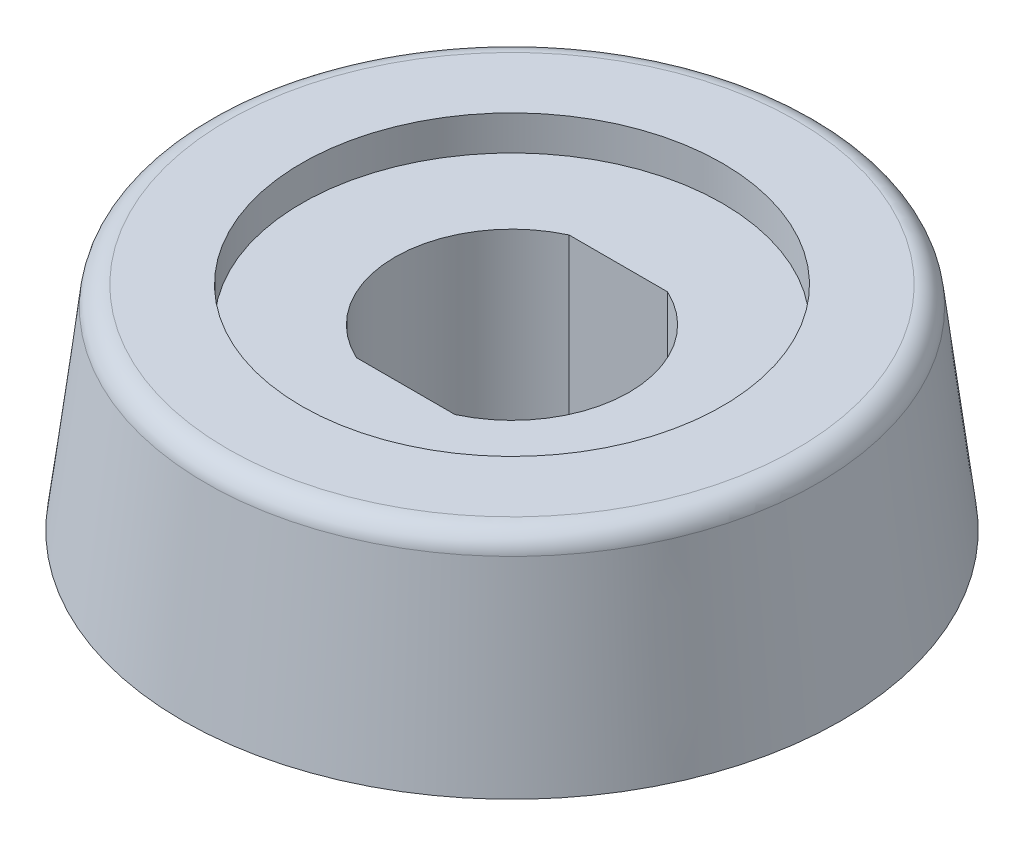
ISO-10303-21;
HEADER;
FILE_DESCRIPTION(('STEP AP214'),'2;1');
FILE_NAME('part.step','',(''),(''),'','','');
FILE_SCHEMA(('AUTOMOTIVE_DESIGN { 1 0 10303 214 1 1 1 1 }'));
ENDSEC;
DATA;
#1=APPLICATION_CONTEXT('core data for automotive mechanical design processes');
#2=APPLICATION_PROTOCOL_DEFINITION('international standard','automotive_design',2000,#1);
#3=PRODUCT_CONTEXT('',#1,'mechanical');
#4=PRODUCT('Part','Part','',(#3));
#5=PRODUCT_RELATED_PRODUCT_CATEGORY('part','',(#4));
#6=PRODUCT_DEFINITION_FORMATION('','',#4);
#7=PRODUCT_DEFINITION_CONTEXT('part definition',#1,'design');
#8=PRODUCT_DEFINITION('design','',#6,#7);
#9=PRODUCT_DEFINITION_SHAPE('','',#8);
#10=(LENGTH_UNIT() NAMED_UNIT(*) SI_UNIT(.MILLI.,.METRE.));
#11=(NAMED_UNIT(*) PLANE_ANGLE_UNIT() SI_UNIT($,.RADIAN.));
#12=(NAMED_UNIT(*) SI_UNIT($,.STERADIAN.) SOLID_ANGLE_UNIT());
#13=UNCERTAINTY_MEASURE_WITH_UNIT(LENGTH_MEASURE(1.E-05),#10,'distance_accuracy_value','');
#14=(GEOMETRIC_REPRESENTATION_CONTEXT(3) GLOBAL_UNCERTAINTY_ASSIGNED_CONTEXT((#13)) GLOBAL_UNIT_ASSIGNED_CONTEXT((#10,
#11,#12)) REPRESENTATION_CONTEXT('',''));
#15=CARTESIAN_POINT('',(0.,0.,0.));
#16=DIRECTION('',(0.,0.,1.));
#17=DIRECTION('',(1.,0.,0.));
#18=AXIS2_PLACEMENT_3D('',#15,#16,#17);
#19=CARTESIAN_POINT('',(-9.325,0.,0.));
#20=DIRECTION('',(0.,-1.,0.));
#21=DIRECTION('',(0.,0.,-1.));
#22=AXIS2_PLACEMENT_3D('',#19,#20,#21);
#23=PLANE('',#22);
#24=CARTESIAN_POINT('',(-9.325,0.,0.));
#25=DIRECTION('',(0.,-1.,0.));
#26=DIRECTION('',(0.,0.,-1.));
#27=AXIS2_PLACEMENT_3D('',#24,#25,#26);
#28=CIRCLE('',#27,5.8);
#29=CARTESIAN_POINT('',(-9.325,0.,-5.8));
#30=VERTEX_POINT('',#29);
#31=EDGE_CURVE('E131',#30,#30,#28,.T.);
#32=ORIENTED_EDGE('',*,*,#31,.F.);
#33=EDGE_LOOP('',(#32));
#34=FACE_BOUND('',#33,.T.);
#35=CARTESIAN_POINT('',(-9.325,0.,0.));
#36=DIRECTION('',(0.,-1.,0.));
#37=DIRECTION('',(0.,0.,-1.));
#38=AXIS2_PLACEMENT_3D('',#35,#36,#37);
#39=CIRCLE('',#38,7.6);
#40=CARTESIAN_POINT('',(-9.325,0.,-7.6));
#41=VERTEX_POINT('',#40);
#42=EDGE_CURVE('E202',#41,#41,#39,.T.);
#43=ORIENTED_EDGE('',*,*,#42,.T.);
#44=EDGE_LOOP('',(#43));
#45=FACE_BOUND('',#44,.T.);
#46=ADVANCED_FACE('F63',(#34,#45),#23,.T.);
#47=CARTESIAN_POINT('',(-9.325,4.9,0.));
#48=DIRECTION('',(0.,-1.,0.));
#49=DIRECTION('',(0.,0.,-1.));
#50=AXIS2_PLACEMENT_3D('',#47,#48,#49);
#51=PLANE('',#50);
#52=CARTESIAN_POINT('',(-9.325,4.9,0.));
#53=DIRECTION('',(0.,-1.,0.));
#54=DIRECTION('',(0.,0.,-1.));
#55=AXIS2_PLACEMENT_3D('',#52,#53,#54);
#56=CIRCLE('',#55,6.55599301929779);
#57=CARTESIAN_POINT('',(-9.325,4.9,-6.55599301929779));
#58=VERTEX_POINT('',#57);
#59=EDGE_CURVE('E13',#58,#58,#56,.F.);
#60=ORIENTED_EDGE('',*,*,#59,.T.);
#61=EDGE_LOOP('',(#60));
#62=FACE_BOUND('',#61,.T.);
#63=CARTESIAN_POINT('',(-9.325,4.9,0.));
#64=DIRECTION('',(0.,-1.,0.));
#65=DIRECTION('',(0.,0.,-1.));
#66=AXIS2_PLACEMENT_3D('',#63,#64,#65);
#67=CIRCLE('',#66,4.85);
#68=CARTESIAN_POINT('',(-9.325,4.9,-4.85));
#69=VERTEX_POINT('',#68);
#70=EDGE_CURVE('E124',#69,#69,#67,.T.);
#71=ORIENTED_EDGE('',*,*,#70,.T.);
#72=EDGE_LOOP('',(#71));
#73=FACE_BOUND('',#72,.T.);
#74=ADVANCED_FACE('F152',(#62,#73),#51,.F.);
#75=CARTESIAN_POINT('',(-9.325,-0.3,0.));
#76=DIRECTION('',(0.,1.,0.));
#77=DIRECTION('',(0.,0.,1.));
#78=AXIS2_PLACEMENT_3D('',#75,#76,#77);
#79=CYLINDRICAL_SURFACE('',#78,5.8);
#80=CARTESIAN_POINT('',(-9.325,-0.3,0.));
#81=DIRECTION('',(0.,-1.,0.));
#82=DIRECTION('',(0.,0.,-1.));
#83=AXIS2_PLACEMENT_3D('',#80,#81,#82);
#84=CIRCLE('',#83,5.8);
#85=CARTESIAN_POINT('',(-9.325,-0.3,-5.8));
#86=VERTEX_POINT('',#85);
#87=EDGE_CURVE('E128',#86,#86,#84,.T.);
#88=ORIENTED_EDGE('',*,*,#87,.F.);
#89=EDGE_LOOP('',(#88));
#90=FACE_BOUND('',#89,.T.);
#91=ORIENTED_EDGE('',*,*,#31,.T.);
#92=EDGE_LOOP('',(#91));
#93=FACE_BOUND('',#92,.T.);
#94=ADVANCED_FACE('F157',(#90,#93),#79,.T.);
#95=CARTESIAN_POINT('',(-9.325,-0.3,0.));
#96=DIRECTION('',(0.,-1.,0.));
#97=DIRECTION('',(0.,0.,-1.));
#98=AXIS2_PLACEMENT_3D('',#95,#96,#97);
#99=PLANE('',#98);
#100=CARTESIAN_POINT('',(-9.325,-0.3,0.));
#101=DIRECTION('',(0.,-1.,0.));
#102=DIRECTION('',(0.,0.,-1.));
#103=AXIS2_PLACEMENT_3D('',#100,#101,#102);
#104=CIRCLE('',#103,3.415);
#105=CARTESIAN_POINT('',(-9.325,-0.3,-3.415));
#106=VERTEX_POINT('',#105);
#107=EDGE_CURVE('E199',#106,#106,#104,.T.);
#108=ORIENTED_EDGE('',*,*,#107,.F.);
#109=EDGE_LOOP('',(#108));
#110=FACE_BOUND('',#109,.T.);
#111=ORIENTED_EDGE('',*,*,#87,.T.);
#112=EDGE_LOOP('',(#111));
#113=FACE_BOUND('',#112,.T.);
#114=ADVANCED_FACE('F165',(#110,#113),#99,.T.);
#115=CARTESIAN_POINT('',(-9.325,-0.3,0.));
#116=DIRECTION('',(0.,1.,0.));
#117=DIRECTION('',(0.,0.,1.));
#118=AXIS2_PLACEMENT_3D('',#115,#116,#117);
#119=CYLINDRICAL_SURFACE('',#118,2.7);
#120=DIRECTION('',(0.,1.,0.));
#121=VECTOR('',#120,1.);
#122=CARTESIAN_POINT('',(-10.459680571791,-0.3,2.45));
#123=LINE('',#122,#121);
#124=CARTESIAN_POINT('',(-10.459680571791,0.,2.45));
#125=VERTEX_POINT('',#124);
#126=CARTESIAN_POINT('',(-10.459680571791,4.1,2.45));
#127=VERTEX_POINT('',#126);
#128=EDGE_CURVE('E120',#125,#127,#123,.T.);
#129=ORIENTED_EDGE('',*,*,#128,.F.);
#130=CARTESIAN_POINT('',(-9.325,0.,0.));
#131=DIRECTION('',(0.,1.,0.));
#132=DIRECTION('',(0.,0.,1.));
#133=AXIS2_PLACEMENT_3D('',#130,#131,#132);
#134=CIRCLE('',#133,2.7);
#135=CARTESIAN_POINT('',(-10.459680571791,0.,-2.45));
#136=VERTEX_POINT('',#135);
#137=EDGE_CURVE('E78',#125,#136,#134,.F.);
#138=ORIENTED_EDGE('',*,*,#137,.T.);
#139=DIRECTION('',(0.,1.,0.));
#140=VECTOR('',#139,1.);
#141=CARTESIAN_POINT('',(-10.459680571791,-0.3,-2.45));
#142=LINE('',#141,#140);
#143=CARTESIAN_POINT('',(-10.459680571791,4.1,-2.45));
#144=VERTEX_POINT('',#143);
#145=EDGE_CURVE('E122',#136,#144,#142,.T.);
#146=ORIENTED_EDGE('',*,*,#145,.T.);
#147=CARTESIAN_POINT('',(-9.325,4.1,0.));
#148=DIRECTION('',(0.,-1.,0.));
#149=DIRECTION('',(0.,0.,-1.));
#150=AXIS2_PLACEMENT_3D('',#147,#148,#149);
#151=CIRCLE('',#150,2.7);
#152=EDGE_CURVE('E136',#144,#127,#151,.F.);
#153=ORIENTED_EDGE('',*,*,#152,.T.);
#154=EDGE_LOOP('',(#129,#138,#146,#153));
#155=FACE_BOUND('',#154,.T.);
#156=ADVANCED_FACE('F169',(#155),#119,.F.);
#157=CARTESIAN_POINT('',(-8.19031942820898,-0.3,-2.45));
#158=DIRECTION('',(0.,0.,-1.));
#159=DIRECTION('',(-1.,0.,0.));
#160=AXIS2_PLACEMENT_3D('',#157,#158,#159);
#161=PLANE('',#160);
#162=ORIENTED_EDGE('',*,*,#145,.F.);
#163=DIRECTION('',(1.,0.,0.));
#164=VECTOR('',#163,1.);
#165=CARTESIAN_POINT('',(-8.19031942820898,0.,-2.45));
#166=LINE('',#165,#164);
#167=CARTESIAN_POINT('',(-8.19031942820898,0.,-2.45));
#168=VERTEX_POINT('',#167);
#169=EDGE_CURVE('E114',#136,#168,#166,.T.);
#170=ORIENTED_EDGE('',*,*,#169,.T.);
#171=DIRECTION('',(0.,1.,0.));
#172=VECTOR('',#171,1.);
#173=CARTESIAN_POINT('',(-8.19031942820898,-0.3,-2.45));
#174=LINE('',#173,#172);
#175=CARTESIAN_POINT('',(-8.19031942820898,4.1,-2.45));
#176=VERTEX_POINT('',#175);
#177=EDGE_CURVE('E113',#168,#176,#174,.T.);
#178=ORIENTED_EDGE('',*,*,#177,.T.);
#179=DIRECTION('',(-1.,0.,0.));
#180=VECTOR('',#179,1.);
#181=CARTESIAN_POINT('',(-8.19031942820898,4.1,-2.45));
#182=LINE('',#181,#180);
#183=EDGE_CURVE('E213',#176,#144,#182,.T.);
#184=ORIENTED_EDGE('',*,*,#183,.T.);
#185=EDGE_LOOP('',(#162,#170,#178,#184));
#186=FACE_BOUND('',#185,.T.);
#187=ADVANCED_FACE('F173',(#186),#161,.F.);
#188=CARTESIAN_POINT('',(-9.325,-0.3,0.));
#189=DIRECTION('',(0.,1.,0.));
#190=DIRECTION('',(0.,0.,1.));
#191=AXIS2_PLACEMENT_3D('',#188,#189,#190);
#192=CYLINDRICAL_SURFACE('',#191,2.7);
#193=ORIENTED_EDGE('',*,*,#177,.F.);
#194=CARTESIAN_POINT('',(-9.325,0.,0.));
#195=DIRECTION('',(0.,1.,0.));
#196=DIRECTION('',(0.,0.,1.));
#197=AXIS2_PLACEMENT_3D('',#194,#195,#196);
#198=CIRCLE('',#197,2.7);
#199=CARTESIAN_POINT('',(-8.19031942820897,0.,2.45));
#200=VERTEX_POINT('',#199);
#201=EDGE_CURVE('E105',#168,#200,#198,.F.);
#202=ORIENTED_EDGE('',*,*,#201,.T.);
#203=DIRECTION('',(0.,1.,0.));
#204=VECTOR('',#203,1.);
#205=CARTESIAN_POINT('',(-8.19031942820897,-0.3,2.45));
#206=LINE('',#205,#204);
#207=CARTESIAN_POINT('',(-8.19031942820897,4.1,2.45));
#208=VERTEX_POINT('',#207);
#209=EDGE_CURVE('E86',#200,#208,#206,.T.);
#210=ORIENTED_EDGE('',*,*,#209,.T.);
#211=CARTESIAN_POINT('',(-9.325,4.1,0.));
#212=DIRECTION('',(0.,-1.,0.));
#213=DIRECTION('',(0.,0.,-1.));
#214=AXIS2_PLACEMENT_3D('',#211,#212,#213);
#215=CIRCLE('',#214,2.7);
#216=EDGE_CURVE('E211',#208,#176,#215,.F.);
#217=ORIENTED_EDGE('',*,*,#216,.T.);
#218=EDGE_LOOP('',(#193,#202,#210,#217));
#219=FACE_BOUND('',#218,.T.);
#220=ADVANCED_FACE('F112',(#219),#192,.F.);
#221=CARTESIAN_POINT('',(-10.459680571791,-0.3,2.45));
#222=DIRECTION('',(0.,0.,1.));
#223=DIRECTION('',(1.,0.,0.));
#224=AXIS2_PLACEMENT_3D('',#221,#222,#223);
#225=PLANE('',#224);
#226=ORIENTED_EDGE('',*,*,#209,.F.);
#227=DIRECTION('',(-1.,0.,0.));
#228=VECTOR('',#227,1.);
#229=CARTESIAN_POINT('',(-10.459680571791,0.,2.45));
#230=LINE('',#229,#228);
#231=EDGE_CURVE('E103',#200,#125,#230,.T.);
#232=ORIENTED_EDGE('',*,*,#231,.T.);
#233=ORIENTED_EDGE('',*,*,#128,.T.);
#234=DIRECTION('',(1.,0.,0.));
#235=VECTOR('',#234,1.);
#236=CARTESIAN_POINT('',(-10.459680571791,4.1,2.45));
#237=LINE('',#236,#235);
#238=EDGE_CURVE('E109',#127,#208,#237,.T.);
#239=ORIENTED_EDGE('',*,*,#238,.T.);
#240=EDGE_LOOP('',(#226,#232,#233,#239));
#241=FACE_BOUND('',#240,.T.);
#242=ADVANCED_FACE('F118',(#241),#225,.F.);
#243=CARTESIAN_POINT('',(-9.325,5.,0.));
#244=DIRECTION('',(0.,-1.,0.));
#245=DIRECTION('',(0.,0.,-1.));
#246=AXIS2_PLACEMENT_3D('',#243,#244,#245);
#247=CYLINDRICAL_SURFACE('',#246,4.85);
#248=CARTESIAN_POINT('',(-9.325,4.1,0.));
#249=DIRECTION('',(0.,-1.,0.));
#250=DIRECTION('',(0.,0.,-1.));
#251=AXIS2_PLACEMENT_3D('',#248,#249,#250);
#252=CIRCLE('',#251,4.85);
#253=CARTESIAN_POINT('',(-9.325,4.1,-4.85));
#254=VERTEX_POINT('',#253);
#255=EDGE_CURVE('E208',#254,#254,#252,.T.);
#256=ORIENTED_EDGE('',*,*,#255,.T.);
#257=EDGE_LOOP('',(#256));
#258=FACE_BOUND('',#257,.T.);
#259=ORIENTED_EDGE('',*,*,#70,.F.);
#260=EDGE_LOOP('',(#259));
#261=FACE_BOUND('',#260,.T.);
#262=ADVANCED_FACE('F177',(#258,#261),#247,.F.);
#263=CARTESIAN_POINT('',(-9.325,4.1,0.));
#264=DIRECTION('',(0.,-1.,0.));
#265=DIRECTION('',(0.,0.,-1.));
#266=AXIS2_PLACEMENT_3D('',#263,#264,#265);
#267=PLANE('',#266);
#268=ORIENTED_EDGE('',*,*,#255,.F.);
#269=EDGE_LOOP('',(#268));
#270=FACE_BOUND('',#269,.T.);
#271=ORIENTED_EDGE('',*,*,#183,.F.);
#272=ORIENTED_EDGE('',*,*,#216,.F.);
#273=ORIENTED_EDGE('',*,*,#238,.F.);
#274=ORIENTED_EDGE('',*,*,#152,.F.);
#275=EDGE_LOOP('',(#271,#272,#273,#274));
#276=FACE_BOUND('',#275,.T.);
#277=ADVANCED_FACE('F185',(#270,#276),#267,.F.);
#278=CARTESIAN_POINT('',(-9.325,0.,-3.415));
#279=DIRECTION('',(0.,1.,0.));
#280=DIRECTION('',(0.,0.,1.));
#281=AXIS2_PLACEMENT_3D('',#278,#279,#280);
#282=PLANE('',#281);
#283=CARTESIAN_POINT('',(-9.325,0.,0.));
#284=DIRECTION('',(0.,-1.,0.));
#285=DIRECTION('',(0.,0.,-1.));
#286=AXIS2_PLACEMENT_3D('',#283,#284,#285);
#287=CIRCLE('',#286,3.415);
#288=CARTESIAN_POINT('',(-9.325,0.,-3.415));
#289=VERTEX_POINT('',#288);
#290=EDGE_CURVE('E115',#289,#289,#287,.T.);
#291=ORIENTED_EDGE('',*,*,#290,.T.);
#292=EDGE_LOOP('',(#291));
#293=FACE_BOUND('',#292,.T.);
#294=ORIENTED_EDGE('',*,*,#231,.F.);
#295=ORIENTED_EDGE('',*,*,#201,.F.);
#296=ORIENTED_EDGE('',*,*,#169,.F.);
#297=ORIENTED_EDGE('',*,*,#137,.F.);
#298=EDGE_LOOP('',(#294,#295,#296,#297));
#299=FACE_BOUND('',#298,.T.);
#300=ADVANCED_FACE('F104',(#293,#299),#282,.F.);
#301=CARTESIAN_POINT('',(-9.325,0.,0.));
#302=DIRECTION('',(0.,-1.,0.));
#303=DIRECTION('',(0.,0.,-1.));
#304=AXIS2_PLACEMENT_3D('',#301,#302,#303);
#305=CYLINDRICAL_SURFACE('',#304,3.415);
#306=ORIENTED_EDGE('',*,*,#290,.F.);
#307=EDGE_LOOP('',(#306));
#308=FACE_BOUND('',#307,.T.);
#309=ORIENTED_EDGE('',*,*,#107,.T.);
#310=EDGE_LOOP('',(#309));
#311=FACE_BOUND('',#310,.T.);
#312=ADVANCED_FACE('F148',(#308,#311),#305,.F.);
#313=CARTESIAN_POINT('',(-9.325,0.,0.));
#314=DIRECTION('',(0.,-1.,0.));
#315=DIRECTION('',(0.,0.,-1.));
#316=AXIS2_PLACEMENT_3D('',#313,#314,#315);
#317=CONICAL_SURFACE('',#316,7.6,0.122173047639603);
#318=CARTESIAN_POINT('',(-9.325,4.46093467170258,0.));
#319=DIRECTION('',(0.,-1.,0.));
#320=DIRECTION('',(0.,0.,-1.));
#321=AXIS2_PLACEMENT_3D('',#318,#319,#320);
#322=CIRCLE('',#321,7.05226609511846);
#323=CARTESIAN_POINT('',(-9.325,4.46093467170258,-7.05226609511845));
#324=VERTEX_POINT('',#323);
#325=EDGE_CURVE('E71',#324,#324,#322,.T.);
#326=ORIENTED_EDGE('',*,*,#325,.T.);
#327=EDGE_LOOP('',(#326));
#328=FACE_BOUND('',#327,.T.);
#329=ORIENTED_EDGE('',*,*,#42,.F.);
#330=EDGE_LOOP('',(#329));
#331=FACE_BOUND('',#330,.T.);
#332=ADVANCED_FACE('F140',(#328,#331),#317,.T.);
#333=CARTESIAN_POINT('',(-9.325,4.4,0.));
#334=DIRECTION('',(0.,-1.,0.));
#335=DIRECTION('',(0.,0.,-1.));
#336=AXIS2_PLACEMENT_3D('',#333,#334,#335);
#337=TOROIDAL_SURFACE('',#336,6.55599301929779,0.5);
#338=ORIENTED_EDGE('',*,*,#59,.F.);
#339=EDGE_LOOP('',(#338));
#340=FACE_BOUND('',#339,.T.);
#341=ORIENTED_EDGE('',*,*,#325,.F.);
#342=EDGE_LOOP('',(#341));
#343=FACE_BOUND('',#342,.T.);
#344=ADVANCED_FACE('F65',(#340,#343),#337,.T.);
#345=CLOSED_SHELL('',(#46,#74,#94,#114,#156,#187,#220,#242,#262,#277,#300,#312,#332,#344));
#346=MANIFOLD_SOLID_BREP('B2',#345);
#347=ADVANCED_BREP_SHAPE_REPRESENTATION('',(#18,#346),#14);
#348=SHAPE_DEFINITION_REPRESENTATION(#9,#347);
ENDSEC;
END-ISO-10303-21;
